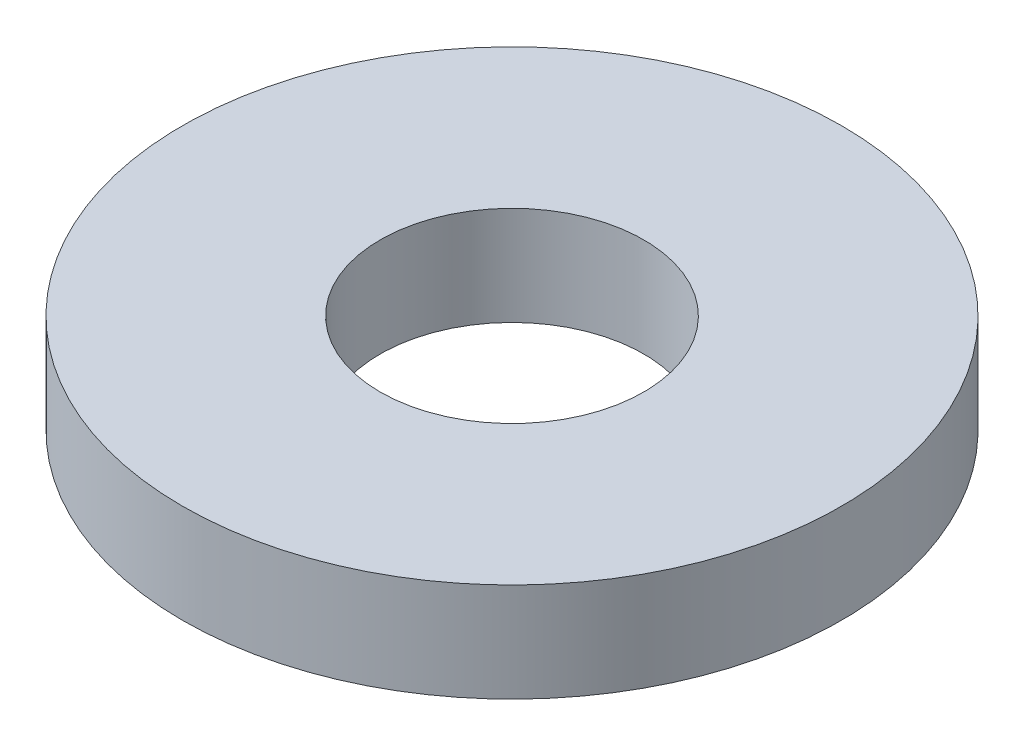
ISO-10303-21;
HEADER;
FILE_DESCRIPTION(('STEP AP214'),'2;1');
FILE_NAME('part.step','',(''),(''),'','','');
FILE_SCHEMA(('AUTOMOTIVE_DESIGN { 1 0 10303 214 1 1 1 1 }'));
ENDSEC;
DATA;
#1=APPLICATION_CONTEXT('core data for automotive mechanical design processes');
#2=APPLICATION_PROTOCOL_DEFINITION('international standard','automotive_design',2000,#1);
#3=PRODUCT_CONTEXT('',#1,'mechanical');
#4=PRODUCT('Part','Part','',(#3));
#5=PRODUCT_RELATED_PRODUCT_CATEGORY('part','',(#4));
#6=PRODUCT_DEFINITION_FORMATION('','',#4);
#7=PRODUCT_DEFINITION_CONTEXT('part definition',#1,'design');
#8=PRODUCT_DEFINITION('design','',#6,#7);
#9=PRODUCT_DEFINITION_SHAPE('','',#8);
#10=(LENGTH_UNIT() NAMED_UNIT(*) SI_UNIT(.MILLI.,.METRE.));
#11=(NAMED_UNIT(*) PLANE_ANGLE_UNIT() SI_UNIT($,.RADIAN.));
#12=(NAMED_UNIT(*) SI_UNIT($,.STERADIAN.) SOLID_ANGLE_UNIT());
#13=UNCERTAINTY_MEASURE_WITH_UNIT(LENGTH_MEASURE(1.E-05),#10,'distance_accuracy_value','');
#14=(GEOMETRIC_REPRESENTATION_CONTEXT(3) GLOBAL_UNCERTAINTY_ASSIGNED_CONTEXT((#13)) GLOBAL_UNIT_ASSIGNED_CONTEXT((#10,
#11,#12)) REPRESENTATION_CONTEXT('',''));
#15=CARTESIAN_POINT('',(0.,0.,0.));
#16=DIRECTION('',(0.,0.,1.));
#17=DIRECTION('',(1.,0.,0.));
#18=AXIS2_PLACEMENT_3D('',#15,#16,#17);
#19=CARTESIAN_POINT('',(0.,3.,0.));
#20=DIRECTION('',(0.,1.,0.));
#21=DIRECTION('',(0.,0.,1.));
#22=AXIS2_PLACEMENT_3D('',#19,#20,#21);
#23=PLANE('',#22);
#24=CARTESIAN_POINT('',(0.,3.,0.));
#25=DIRECTION('',(0.,1.,0.));
#26=DIRECTION('',(0.,0.,1.));
#27=AXIS2_PLACEMENT_3D('',#24,#25,#26);
#28=CIRCLE('',#27,10.);
#29=CARTESIAN_POINT('',(0.,3.,10.));
#30=VERTEX_POINT('',#29);
#31=EDGE_CURVE('E10',#30,#30,#28,.T.);
#32=ORIENTED_EDGE('',*,*,#31,.T.);
#33=EDGE_LOOP('',(#32));
#34=FACE_BOUND('',#33,.T.);
#35=CARTESIAN_POINT('',(0.,3.,0.));
#36=DIRECTION('',(0.,1.,0.));
#37=DIRECTION('',(0.,0.,1.));
#38=AXIS2_PLACEMENT_3D('',#35,#36,#37);
#39=CIRCLE('',#38,4.);
#40=CARTESIAN_POINT('',(0.,3.,4.));
#41=VERTEX_POINT('',#40);
#42=EDGE_CURVE('E42',#41,#41,#39,.T.);
#43=ORIENTED_EDGE('',*,*,#42,.F.);
#44=EDGE_LOOP('',(#43));
#45=FACE_BOUND('',#44,.T.);
#46=ADVANCED_FACE('F31',(#34,#45),#23,.T.);
#47=CARTESIAN_POINT('',(0.,0.,0.));
#48=DIRECTION('',(0.,1.,0.));
#49=DIRECTION('',(0.,0.,1.));
#50=AXIS2_PLACEMENT_3D('',#47,#48,#49);
#51=PLANE('',#50);
#52=CARTESIAN_POINT('',(0.,0.,0.));
#53=DIRECTION('',(0.,1.,0.));
#54=DIRECTION('',(0.,0.,1.));
#55=AXIS2_PLACEMENT_3D('',#52,#53,#54);
#56=CIRCLE('',#55,10.);
#57=CARTESIAN_POINT('',(0.,0.,10.));
#58=VERTEX_POINT('',#57);
#59=EDGE_CURVE('E35',#58,#58,#56,.T.);
#60=ORIENTED_EDGE('',*,*,#59,.F.);
#61=EDGE_LOOP('',(#60));
#62=FACE_BOUND('',#61,.T.);
#63=CARTESIAN_POINT('',(0.,0.,0.));
#64=DIRECTION('',(0.,1.,0.));
#65=DIRECTION('',(0.,0.,1.));
#66=AXIS2_PLACEMENT_3D('',#63,#64,#65);
#67=CIRCLE('',#66,4.);
#68=CARTESIAN_POINT('',(0.,0.,4.));
#69=VERTEX_POINT('',#68);
#70=EDGE_CURVE('E44',#69,#69,#67,.T.);
#71=ORIENTED_EDGE('',*,*,#70,.T.);
#72=EDGE_LOOP('',(#71));
#73=FACE_BOUND('',#72,.T.);
#74=ADVANCED_FACE('F54',(#62,#73),#51,.F.);
#75=CARTESIAN_POINT('',(0.,3.,0.));
#76=DIRECTION('',(0.,-1.,0.));
#77=DIRECTION('',(0.,0.,-1.));
#78=AXIS2_PLACEMENT_3D('',#75,#76,#77);
#79=CYLINDRICAL_SURFACE('',#78,10.);
#80=ORIENTED_EDGE('',*,*,#31,.F.);
#81=EDGE_LOOP('',(#80));
#82=FACE_BOUND('',#81,.T.);
#83=ORIENTED_EDGE('',*,*,#59,.T.);
#84=EDGE_LOOP('',(#83));
#85=FACE_BOUND('',#84,.T.);
#86=ADVANCED_FACE('F33',(#82,#85),#79,.T.);
#87=CARTESIAN_POINT('',(0.,3.,0.));
#88=DIRECTION('',(0.,-1.,0.));
#89=DIRECTION('',(0.,0.,-1.));
#90=AXIS2_PLACEMENT_3D('',#87,#88,#89);
#91=CYLINDRICAL_SURFACE('',#90,4.);
#92=ORIENTED_EDGE('',*,*,#42,.T.);
#93=EDGE_LOOP('',(#92));
#94=FACE_BOUND('',#93,.T.);
#95=ORIENTED_EDGE('',*,*,#70,.F.);
#96=EDGE_LOOP('',(#95));
#97=FACE_BOUND('',#96,.T.);
#98=ADVANCED_FACE('F50',(#94,#97),#91,.F.);
#99=CLOSED_SHELL('',(#46,#74,#86,#98));
#100=MANIFOLD_SOLID_BREP('B2',#99);
#101=ADVANCED_BREP_SHAPE_REPRESENTATION('',(#18,#100),#14);
#102=SHAPE_DEFINITION_REPRESENTATION(#9,#101);
ENDSEC;
END-ISO-10303-21;
